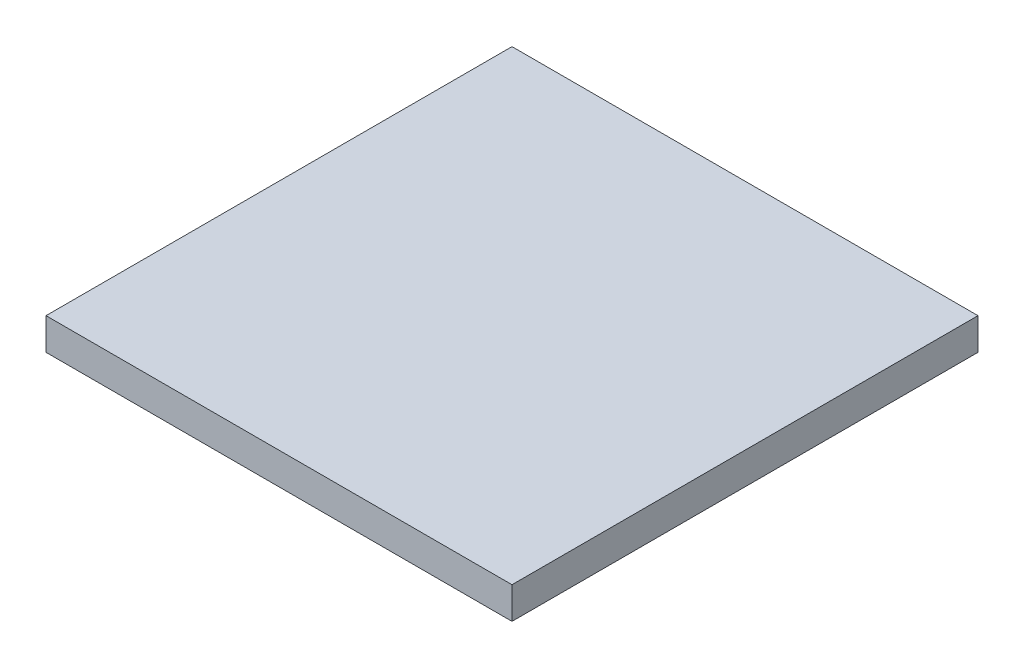
ISO-10303-21;
HEADER;
FILE_DESCRIPTION(('STEP AP214'),'2;1');
FILE_NAME('part.step','',(''),(''),'','','');
FILE_SCHEMA(('AUTOMOTIVE_DESIGN { 1 0 10303 214 1 1 1 1 }'));
ENDSEC;
DATA;
#1=APPLICATION_CONTEXT('core data for automotive mechanical design processes');
#2=APPLICATION_PROTOCOL_DEFINITION('international standard','automotive_design',2000,#1);
#3=PRODUCT_CONTEXT('',#1,'mechanical');
#4=PRODUCT('Part','Part','',(#3));
#5=PRODUCT_RELATED_PRODUCT_CATEGORY('part','',(#4));
#6=PRODUCT_DEFINITION_FORMATION('','',#4);
#7=PRODUCT_DEFINITION_CONTEXT('part definition',#1,'design');
#8=PRODUCT_DEFINITION('design','',#6,#7);
#9=PRODUCT_DEFINITION_SHAPE('','',#8);
#10=(LENGTH_UNIT() NAMED_UNIT(*) SI_UNIT(.MILLI.,.METRE.));
#11=(NAMED_UNIT(*) PLANE_ANGLE_UNIT() SI_UNIT($,.RADIAN.));
#12=(NAMED_UNIT(*) SI_UNIT($,.STERADIAN.) SOLID_ANGLE_UNIT());
#13=UNCERTAINTY_MEASURE_WITH_UNIT(LENGTH_MEASURE(1.E-05),#10,'distance_accuracy_value','');
#14=(GEOMETRIC_REPRESENTATION_CONTEXT(3) GLOBAL_UNCERTAINTY_ASSIGNED_CONTEXT((#13)) GLOBAL_UNIT_ASSIGNED_CONTEXT((#10,
#11,#12)) REPRESENTATION_CONTEXT('',''));
#15=CARTESIAN_POINT('',(0.,0.,0.));
#16=DIRECTION('',(0.,0.,1.));
#17=DIRECTION('',(1.,0.,0.));
#18=AXIS2_PLACEMENT_3D('',#15,#16,#17);
#19=CARTESIAN_POINT('',(-22.,3.,-22.));
#20=DIRECTION('',(1.,0.,0.));
#21=DIRECTION('',(0.,0.,-1.));
#22=AXIS2_PLACEMENT_3D('',#19,#20,#21);
#23=PLANE('',#22);
#24=DIRECTION('',(0.,0.,1.));
#25=VECTOR('',#24,1.);
#26=CARTESIAN_POINT('',(-22.,0.,-22.));
#27=LINE('',#26,#25);
#28=CARTESIAN_POINT('',(-22.,0.,-22.));
#29=VERTEX_POINT('',#28);
#30=CARTESIAN_POINT('',(-22.,0.,22.));
#31=VERTEX_POINT('',#30);
#32=EDGE_CURVE('E100',#29,#31,#27,.T.);
#33=ORIENTED_EDGE('',*,*,#32,.T.);
#34=DIRECTION('',(0.,-1.,0.));
#35=VECTOR('',#34,1.);
#36=CARTESIAN_POINT('',(-22.,3.,22.));
#37=LINE('',#36,#35);
#38=CARTESIAN_POINT('',(-22.,3.,22.));
#39=VERTEX_POINT('',#38);
#40=EDGE_CURVE('E11',#39,#31,#37,.T.);
#41=ORIENTED_EDGE('',*,*,#40,.F.);
#42=DIRECTION('',(0.,0.,1.));
#43=VECTOR('',#42,1.);
#44=CARTESIAN_POINT('',(-22.,3.,-22.));
#45=LINE('',#44,#43);
#46=CARTESIAN_POINT('',(-22.,3.,-22.));
#47=VERTEX_POINT('',#46);
#48=EDGE_CURVE('E88',#47,#39,#45,.T.);
#49=ORIENTED_EDGE('',*,*,#48,.F.);
#50=DIRECTION('',(0.,-1.,0.));
#51=VECTOR('',#50,1.);
#52=CARTESIAN_POINT('',(-22.,3.,-22.));
#53=LINE('',#52,#51);
#54=EDGE_CURVE('E96',#47,#29,#53,.T.);
#55=ORIENTED_EDGE('',*,*,#54,.T.);
#56=EDGE_LOOP('',(#33,#41,#49,#55));
#57=FACE_BOUND('',#56,.T.);
#58=ADVANCED_FACE('F37',(#57),#23,.F.);
#59=CARTESIAN_POINT('',(22.,3.,22.));
#60=DIRECTION('',(0.,0.,-1.));
#61=DIRECTION('',(-1.,0.,0.));
#62=AXIS2_PLACEMENT_3D('',#59,#60,#61);
#63=PLANE('',#62);
#64=DIRECTION('',(1.,0.,0.));
#65=VECTOR('',#64,1.);
#66=CARTESIAN_POINT('',(22.,0.,22.));
#67=LINE('',#66,#65);
#68=CARTESIAN_POINT('',(22.,0.,22.));
#69=VERTEX_POINT('',#68);
#70=EDGE_CURVE('E92',#31,#69,#67,.T.);
#71=ORIENTED_EDGE('',*,*,#70,.T.);
#72=DIRECTION('',(0.,-1.,0.));
#73=VECTOR('',#72,1.);
#74=CARTESIAN_POINT('',(22.,3.,22.));
#75=LINE('',#74,#73);
#76=CARTESIAN_POINT('',(22.,3.,22.));
#77=VERTEX_POINT('',#76);
#78=EDGE_CURVE('E45',#77,#69,#75,.T.);
#79=ORIENTED_EDGE('',*,*,#78,.F.);
#80=DIRECTION('',(1.,0.,0.));
#81=VECTOR('',#80,1.);
#82=CARTESIAN_POINT('',(22.,3.,22.));
#83=LINE('',#82,#81);
#84=EDGE_CURVE('E83',#39,#77,#83,.T.);
#85=ORIENTED_EDGE('',*,*,#84,.F.);
#86=ORIENTED_EDGE('',*,*,#40,.T.);
#87=EDGE_LOOP('',(#71,#79,#85,#86));
#88=FACE_BOUND('',#87,.T.);
#89=ADVANCED_FACE('F91',(#88),#63,.F.);
#90=CARTESIAN_POINT('',(22.,3.,-22.));
#91=DIRECTION('',(-1.,0.,0.));
#92=DIRECTION('',(0.,0.,1.));
#93=AXIS2_PLACEMENT_3D('',#90,#91,#92);
#94=PLANE('',#93);
#95=DIRECTION('',(0.,0.,-1.));
#96=VECTOR('',#95,1.);
#97=CARTESIAN_POINT('',(22.,0.,-22.));
#98=LINE('',#97,#96);
#99=CARTESIAN_POINT('',(22.,0.,-22.));
#100=VERTEX_POINT('',#99);
#101=EDGE_CURVE('E70',#69,#100,#98,.T.);
#102=ORIENTED_EDGE('',*,*,#101,.T.);
#103=DIRECTION('',(0.,-1.,0.));
#104=VECTOR('',#103,1.);
#105=CARTESIAN_POINT('',(22.,3.,-22.));
#106=LINE('',#105,#104);
#107=CARTESIAN_POINT('',(22.,3.,-22.));
#108=VERTEX_POINT('',#107);
#109=EDGE_CURVE('E93',#108,#100,#106,.T.);
#110=ORIENTED_EDGE('',*,*,#109,.F.);
#111=DIRECTION('',(0.,0.,-1.));
#112=VECTOR('',#111,1.);
#113=CARTESIAN_POINT('',(22.,3.,-22.));
#114=LINE('',#113,#112);
#115=EDGE_CURVE('E86',#77,#108,#114,.T.);
#116=ORIENTED_EDGE('',*,*,#115,.F.);
#117=ORIENTED_EDGE('',*,*,#78,.T.);
#118=EDGE_LOOP('',(#102,#110,#116,#117));
#119=FACE_BOUND('',#118,.T.);
#120=ADVANCED_FACE('F94',(#119),#94,.F.);
#121=CARTESIAN_POINT('',(22.,3.,-22.));
#122=DIRECTION('',(0.,0.,1.));
#123=DIRECTION('',(1.,0.,0.));
#124=AXIS2_PLACEMENT_3D('',#121,#122,#123);
#125=PLANE('',#124);
#126=DIRECTION('',(-1.,0.,0.));
#127=VECTOR('',#126,1.);
#128=CARTESIAN_POINT('',(22.,0.,-22.));
#129=LINE('',#128,#127);
#130=EDGE_CURVE('E76',#100,#29,#129,.T.);
#131=ORIENTED_EDGE('',*,*,#130,.T.);
#132=ORIENTED_EDGE('',*,*,#54,.F.);
#133=DIRECTION('',(-1.,0.,0.));
#134=VECTOR('',#133,1.);
#135=CARTESIAN_POINT('',(22.,3.,-22.));
#136=LINE('',#135,#134);
#137=EDGE_CURVE('E53',#108,#47,#136,.T.);
#138=ORIENTED_EDGE('',*,*,#137,.F.);
#139=ORIENTED_EDGE('',*,*,#109,.T.);
#140=EDGE_LOOP('',(#131,#132,#138,#139));
#141=FACE_BOUND('',#140,.T.);
#142=ADVANCED_FACE('F107',(#141),#125,.F.);
#143=CARTESIAN_POINT('',(0.,3.,0.));
#144=DIRECTION('',(0.,-1.,0.));
#145=DIRECTION('',(0.,0.,-1.));
#146=AXIS2_PLACEMENT_3D('',#143,#144,#145);
#147=PLANE('',#146);
#148=ORIENTED_EDGE('',*,*,#48,.T.);
#149=ORIENTED_EDGE('',*,*,#84,.T.);
#150=ORIENTED_EDGE('',*,*,#115,.T.);
#151=ORIENTED_EDGE('',*,*,#137,.T.);
#152=EDGE_LOOP('',(#148,#149,#150,#151));
#153=FACE_BOUND('',#152,.T.);
#154=ADVANCED_FACE('F84',(#153),#147,.F.);
#155=CARTESIAN_POINT('',(0.,0.,0.));
#156=DIRECTION('',(0.,-1.,0.));
#157=DIRECTION('',(0.,0.,-1.));
#158=AXIS2_PLACEMENT_3D('',#155,#156,#157);
#159=PLANE('',#158);
#160=ORIENTED_EDGE('',*,*,#32,.F.);
#161=ORIENTED_EDGE('',*,*,#130,.F.);
#162=ORIENTED_EDGE('',*,*,#101,.F.);
#163=ORIENTED_EDGE('',*,*,#70,.F.);
#164=EDGE_LOOP('',(#160,#161,#162,#163));
#165=FACE_BOUND('',#164,.T.);
#166=ADVANCED_FACE('F110',(#165),#159,.T.);
#167=CLOSED_SHELL('',(#58,#89,#120,#142,#154,#166));
#168=MANIFOLD_SOLID_BREP('B2',#167);
#169=ADVANCED_BREP_SHAPE_REPRESENTATION('',(#18,#168),#14);
#170=SHAPE_DEFINITION_REPRESENTATION(#9,#169);
ENDSEC;
END-ISO-10303-21;
